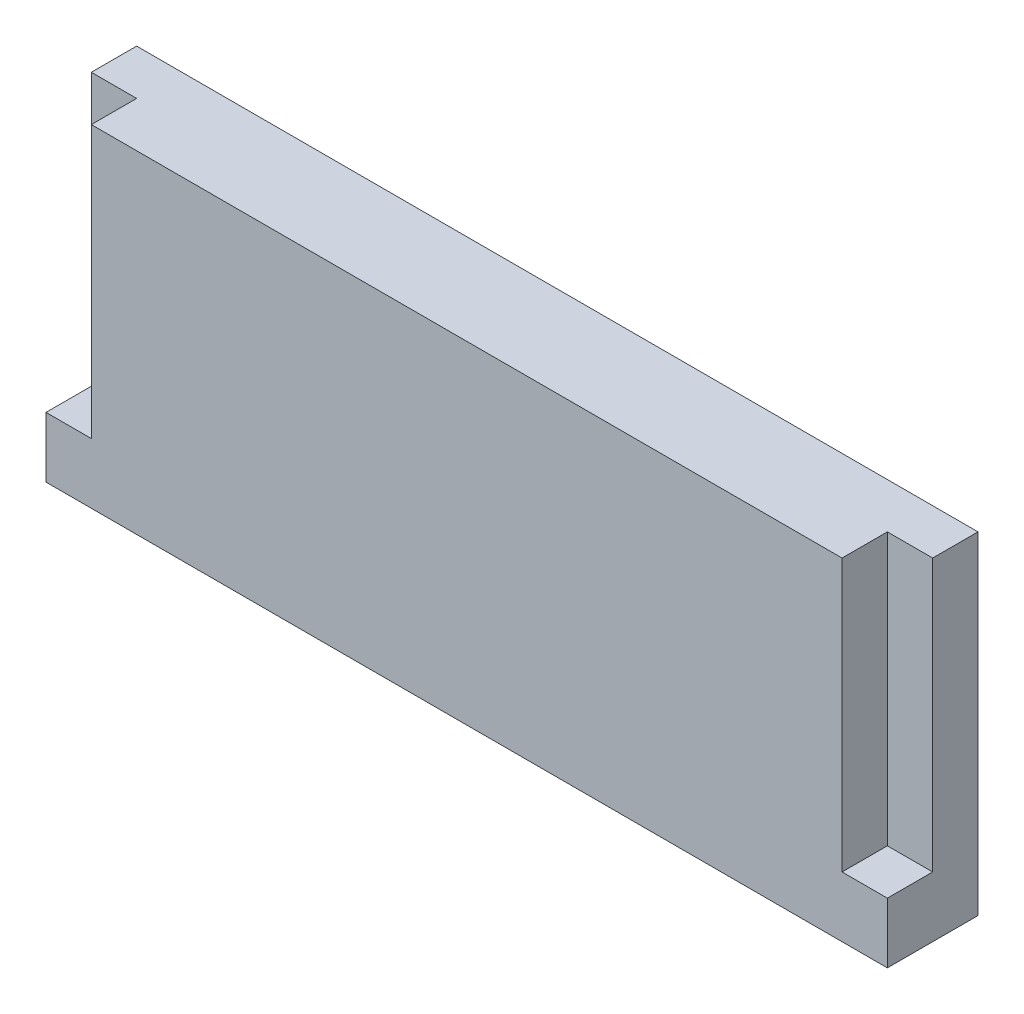
ISO-10303-21;
HEADER;
FILE_DESCRIPTION(('STEP AP214'),'2;1');
FILE_NAME('part.step','',(''),(''),'','','');
FILE_SCHEMA(('AUTOMOTIVE_DESIGN { 1 0 10303 214 1 1 1 1 }'));
ENDSEC;
DATA;
#1=APPLICATION_CONTEXT('core data for automotive mechanical design processes');
#2=APPLICATION_PROTOCOL_DEFINITION('international standard','automotive_design',2000,#1);
#3=PRODUCT_CONTEXT('',#1,'mechanical');
#4=PRODUCT('Part','Part','',(#3));
#5=PRODUCT_RELATED_PRODUCT_CATEGORY('part','',(#4));
#6=PRODUCT_DEFINITION_FORMATION('','',#4);
#7=PRODUCT_DEFINITION_CONTEXT('part definition',#1,'design');
#8=PRODUCT_DEFINITION('design','',#6,#7);
#9=PRODUCT_DEFINITION_SHAPE('','',#8);
#10=(LENGTH_UNIT() NAMED_UNIT(*) SI_UNIT(.MILLI.,.METRE.));
#11=(NAMED_UNIT(*) PLANE_ANGLE_UNIT() SI_UNIT($,.RADIAN.));
#12=(NAMED_UNIT(*) SI_UNIT($,.STERADIAN.) SOLID_ANGLE_UNIT());
#13=UNCERTAINTY_MEASURE_WITH_UNIT(LENGTH_MEASURE(1.E-05),#10,'distance_accuracy_value','');
#14=(GEOMETRIC_REPRESENTATION_CONTEXT(3) GLOBAL_UNCERTAINTY_ASSIGNED_CONTEXT((#13)) GLOBAL_UNIT_ASSIGNED_CONTEXT((#10,
#11,#12)) REPRESENTATION_CONTEXT('',''));
#15=CARTESIAN_POINT('',(0.,0.,0.));
#16=DIRECTION('',(0.,0.,1.));
#17=DIRECTION('',(1.,0.,0.));
#18=AXIS2_PLACEMENT_3D('',#15,#16,#17);
#19=CARTESIAN_POINT('',(0.,18.,-3.));
#20=DIRECTION('',(1.,0.,0.));
#21=DIRECTION('',(0.,0.,-1.));
#22=AXIS2_PLACEMENT_3D('',#19,#20,#21);
#23=PLANE('',#22);
#24=DIRECTION('',(0.,-1.,0.));
#25=VECTOR('',#24,1.);
#26=CARTESIAN_POINT('',(0.,18.,-3.));
#27=LINE('',#26,#25);
#28=CARTESIAN_POINT('',(0.,18.,-3.));
#29=VERTEX_POINT('',#28);
#30=CARTESIAN_POINT('',(0.,-4.,-3.00000000000001));
#31=VERTEX_POINT('',#30);
#32=EDGE_CURVE('E109',#29,#31,#27,.T.);
#33=ORIENTED_EDGE('',*,*,#32,.T.);
#34=DIRECTION('',(0.,0.,-1.));
#35=VECTOR('',#34,1.);
#36=CARTESIAN_POINT('',(0.,-4.,3.));
#37=LINE('',#36,#35);
#38=CARTESIAN_POINT('',(0.,-4.,3.));
#39=VERTEX_POINT('',#38);
#40=EDGE_CURVE('E113',#39,#31,#37,.T.);
#41=ORIENTED_EDGE('',*,*,#40,.F.);
#42=DIRECTION('',(0.,1.,0.));
#43=VECTOR('',#42,1.);
#44=CARTESIAN_POINT('',(0.,-4.,3.));
#45=LINE('',#44,#43);
#46=CARTESIAN_POINT('',(0.,0.,3.));
#47=VERTEX_POINT('',#46);
#48=EDGE_CURVE('E139',#39,#47,#45,.T.);
#49=ORIENTED_EDGE('',*,*,#48,.T.);
#50=DIRECTION('',(0.,0.,-1.));
#51=VECTOR('',#50,1.);
#52=CARTESIAN_POINT('',(0.,0.,3.));
#53=LINE('',#52,#51);
#54=CARTESIAN_POINT('',(0.,0.,0.));
#55=VERTEX_POINT('',#54);
#56=EDGE_CURVE('E145',#47,#55,#53,.T.);
#57=ORIENTED_EDGE('',*,*,#56,.T.);
#58=DIRECTION('',(0.,-1.,0.));
#59=VECTOR('',#58,1.);
#60=CARTESIAN_POINT('',(0.,18.,0.));
#61=LINE('',#60,#59);
#62=CARTESIAN_POINT('',(0.,18.,0.));
#63=VERTEX_POINT('',#62);
#64=EDGE_CURVE('E11',#63,#55,#61,.T.);
#65=ORIENTED_EDGE('',*,*,#64,.F.);
#66=DIRECTION('',(0.,0.,1.));
#67=VECTOR('',#66,1.);
#68=CARTESIAN_POINT('',(0.,18.,-3.));
#69=LINE('',#68,#67);
#70=EDGE_CURVE('E115',#29,#63,#69,.T.);
#71=ORIENTED_EDGE('',*,*,#70,.F.);
#72=EDGE_LOOP('',(#33,#41,#49,#57,#65,#71));
#73=FACE_BOUND('',#72,.T.);
#74=ADVANCED_FACE('F35',(#73),#23,.F.);
#75=CARTESIAN_POINT('',(0.,18.,0.));
#76=DIRECTION('',(0.,0.,-1.));
#77=DIRECTION('',(-1.,0.,0.));
#78=AXIS2_PLACEMENT_3D('',#75,#76,#77);
#79=PLANE('',#78);
#80=DIRECTION('',(1.,0.,0.));
#81=VECTOR('',#80,1.);
#82=CARTESIAN_POINT('',(0.,0.,0.));
#83=LINE('',#82,#81);
#84=CARTESIAN_POINT('',(3.,0.,0.));
#85=VERTEX_POINT('',#84);
#86=EDGE_CURVE('E157',#55,#85,#83,.T.);
#87=ORIENTED_EDGE('',*,*,#86,.T.);
#88=DIRECTION('',(0.,-1.,0.));
#89=VECTOR('',#88,1.);
#90=CARTESIAN_POINT('',(3.,18.,0.));
#91=LINE('',#90,#89);
#92=CARTESIAN_POINT('',(3.,18.,0.));
#93=VERTEX_POINT('',#92);
#94=EDGE_CURVE('E44',#93,#85,#91,.T.);
#95=ORIENTED_EDGE('',*,*,#94,.F.);
#96=DIRECTION('',(1.,0.,0.));
#97=VECTOR('',#96,1.);
#98=CARTESIAN_POINT('',(0.,18.,0.));
#99=LINE('',#98,#97);
#100=EDGE_CURVE('E227',#63,#93,#99,.T.);
#101=ORIENTED_EDGE('',*,*,#100,.F.);
#102=ORIENTED_EDGE('',*,*,#64,.T.);
#103=EDGE_LOOP('',(#87,#95,#101,#102));
#104=FACE_BOUND('',#103,.T.);
#105=ADVANCED_FACE('F226',(#104),#79,.F.);
#106=CARTESIAN_POINT('',(3.,18.,0.));
#107=DIRECTION('',(1.,0.,0.));
#108=DIRECTION('',(0.,0.,-1.));
#109=AXIS2_PLACEMENT_3D('',#106,#107,#108);
#110=PLANE('',#109);
#111=DIRECTION('',(0.,0.,1.));
#112=VECTOR('',#111,1.);
#113=CARTESIAN_POINT('',(3.,0.,0.));
#114=LINE('',#113,#112);
#115=CARTESIAN_POINT('',(3.,0.,3.));
#116=VERTEX_POINT('',#115);
#117=EDGE_CURVE('E162',#85,#116,#114,.T.);
#118=ORIENTED_EDGE('',*,*,#117,.T.);
#119=DIRECTION('',(0.,-1.,0.));
#120=VECTOR('',#119,1.);
#121=CARTESIAN_POINT('',(3.,18.,3.));
#122=LINE('',#121,#120);
#123=CARTESIAN_POINT('',(3.,18.,3.));
#124=VERTEX_POINT('',#123);
#125=EDGE_CURVE('E195',#124,#116,#122,.T.);
#126=ORIENTED_EDGE('',*,*,#125,.F.);
#127=DIRECTION('',(0.,0.,1.));
#128=VECTOR('',#127,1.);
#129=CARTESIAN_POINT('',(3.,18.,0.));
#130=LINE('',#129,#128);
#131=EDGE_CURVE('E225',#93,#124,#130,.T.);
#132=ORIENTED_EDGE('',*,*,#131,.F.);
#133=ORIENTED_EDGE('',*,*,#94,.T.);
#134=EDGE_LOOP('',(#118,#126,#132,#133));
#135=FACE_BOUND('',#134,.T.);
#136=ADVANCED_FACE('F223',(#135),#110,.F.);
#137=CARTESIAN_POINT('',(3.,18.,3.));
#138=DIRECTION('',(0.,0.,-1.));
#139=DIRECTION('',(-1.,0.,0.));
#140=AXIS2_PLACEMENT_3D('',#137,#138,#139);
#141=PLANE('',#140);
#142=ORIENTED_EDGE('',*,*,#125,.T.);
#143=DIRECTION('',(-1.,0.,0.));
#144=VECTOR('',#143,1.);
#145=CARTESIAN_POINT('',(0.,0.,3.));
#146=LINE('',#145,#144);
#147=EDGE_CURVE('E134',#116,#47,#146,.T.);
#148=ORIENTED_EDGE('',*,*,#147,.T.);
#149=ORIENTED_EDGE('',*,*,#48,.F.);
#150=DIRECTION('',(-1.,0.,0.));
#151=VECTOR('',#150,1.);
#152=CARTESIAN_POINT('',(0.,-4.,3.));
#153=LINE('',#152,#151);
#154=CARTESIAN_POINT('',(55.7,-4.,3.));
#155=VERTEX_POINT('',#154);
#156=EDGE_CURVE('E129',#155,#39,#153,.T.);
#157=ORIENTED_EDGE('',*,*,#156,.F.);
#158=DIRECTION('',(0.,1.,0.));
#159=VECTOR('',#158,1.);
#160=CARTESIAN_POINT('',(55.7,-4.,3.));
#161=LINE('',#160,#159);
#162=CARTESIAN_POINT('',(55.7,0.,3.));
#163=VERTEX_POINT('',#162);
#164=EDGE_CURVE('E149',#155,#163,#161,.T.);
#165=ORIENTED_EDGE('',*,*,#164,.T.);
#166=CARTESIAN_POINT('',(52.7,0.,3.));
#167=VERTEX_POINT('',#166);
#168=EDGE_CURVE('E131',#163,#167,#146,.T.);
#169=ORIENTED_EDGE('',*,*,#168,.T.);
#170=DIRECTION('',(0.,-1.,0.));
#171=VECTOR('',#170,1.);
#172=CARTESIAN_POINT('',(52.7,18.,3.));
#173=LINE('',#172,#171);
#174=CARTESIAN_POINT('',(52.7,18.,3.));
#175=VERTEX_POINT('',#174);
#176=EDGE_CURVE('E190',#175,#167,#173,.T.);
#177=ORIENTED_EDGE('',*,*,#176,.F.);
#178=DIRECTION('',(1.,0.,0.));
#179=VECTOR('',#178,1.);
#180=CARTESIAN_POINT('',(3.,18.,3.));
#181=LINE('',#180,#179);
#182=EDGE_CURVE('E235',#124,#175,#181,.T.);
#183=ORIENTED_EDGE('',*,*,#182,.F.);
#184=EDGE_LOOP('',(#142,#148,#149,#157,#165,#169,#177,#183));
#185=FACE_BOUND('',#184,.T.);
#186=ADVANCED_FACE('F240',(#185),#141,.F.);
#187=CARTESIAN_POINT('',(52.7,18.,3.));
#188=DIRECTION('',(-1.,0.,0.));
#189=DIRECTION('',(0.,0.,1.));
#190=AXIS2_PLACEMENT_3D('',#187,#188,#189);
#191=PLANE('',#190);
#192=DIRECTION('',(0.,0.,-1.));
#193=VECTOR('',#192,1.);
#194=CARTESIAN_POINT('',(52.7,0.,3.));
#195=LINE('',#194,#193);
#196=CARTESIAN_POINT('',(52.7,0.,0.));
#197=VERTEX_POINT('',#196);
#198=EDGE_CURVE('E168',#167,#197,#195,.T.);
#199=ORIENTED_EDGE('',*,*,#198,.T.);
#200=DIRECTION('',(0.,-1.,0.));
#201=VECTOR('',#200,1.);
#202=CARTESIAN_POINT('',(52.7,18.,0.));
#203=LINE('',#202,#201);
#204=CARTESIAN_POINT('',(52.7,18.,0.));
#205=VERTEX_POINT('',#204);
#206=EDGE_CURVE('E188',#205,#197,#203,.T.);
#207=ORIENTED_EDGE('',*,*,#206,.F.);
#208=DIRECTION('',(0.,0.,-1.));
#209=VECTOR('',#208,1.);
#210=CARTESIAN_POINT('',(52.7,18.,3.));
#211=LINE('',#210,#209);
#212=EDGE_CURVE('E237',#175,#205,#211,.T.);
#213=ORIENTED_EDGE('',*,*,#212,.F.);
#214=ORIENTED_EDGE('',*,*,#176,.T.);
#215=EDGE_LOOP('',(#199,#207,#213,#214));
#216=FACE_BOUND('',#215,.T.);
#217=ADVANCED_FACE('F209',(#216),#191,.F.);
#218=CARTESIAN_POINT('',(52.7,18.,0.));
#219=DIRECTION('',(0.,0.,-1.));
#220=DIRECTION('',(-1.,0.,0.));
#221=AXIS2_PLACEMENT_3D('',#218,#219,#220);
#222=PLANE('',#221);
#223=DIRECTION('',(1.,0.,0.));
#224=VECTOR('',#223,1.);
#225=CARTESIAN_POINT('',(52.7,0.,0.));
#226=LINE('',#225,#224);
#227=CARTESIAN_POINT('',(55.7,0.,0.));
#228=VERTEX_POINT('',#227);
#229=EDGE_CURVE('E177',#197,#228,#226,.T.);
#230=ORIENTED_EDGE('',*,*,#229,.T.);
#231=DIRECTION('',(0.,-1.,0.));
#232=VECTOR('',#231,1.);
#233=CARTESIAN_POINT('',(55.7,18.,0.));
#234=LINE('',#233,#232);
#235=CARTESIAN_POINT('',(55.7,18.,0.));
#236=VERTEX_POINT('',#235);
#237=EDGE_CURVE('E181',#236,#228,#234,.T.);
#238=ORIENTED_EDGE('',*,*,#237,.F.);
#239=DIRECTION('',(1.,0.,0.));
#240=VECTOR('',#239,1.);
#241=CARTESIAN_POINT('',(52.7,18.,0.));
#242=LINE('',#241,#240);
#243=EDGE_CURVE('E204',#205,#236,#242,.T.);
#244=ORIENTED_EDGE('',*,*,#243,.F.);
#245=ORIENTED_EDGE('',*,*,#206,.T.);
#246=EDGE_LOOP('',(#230,#238,#244,#245));
#247=FACE_BOUND('',#246,.T.);
#248=ADVANCED_FACE('F203',(#247),#222,.F.);
#249=CARTESIAN_POINT('',(55.7,18.,0.));
#250=DIRECTION('',(-1.,0.,0.));
#251=DIRECTION('',(0.,0.,1.));
#252=AXIS2_PLACEMENT_3D('',#249,#250,#251);
#253=PLANE('',#252);
#254=ORIENTED_EDGE('',*,*,#237,.T.);
#255=DIRECTION('',(0.,0.,1.));
#256=VECTOR('',#255,1.);
#257=CARTESIAN_POINT('',(55.7,0.,3.));
#258=LINE('',#257,#256);
#259=EDGE_CURVE('E148',#228,#163,#258,.T.);
#260=ORIENTED_EDGE('',*,*,#259,.T.);
#261=ORIENTED_EDGE('',*,*,#164,.F.);
#262=DIRECTION('',(0.,0.,1.));
#263=VECTOR('',#262,1.);
#264=CARTESIAN_POINT('',(55.7,-4.,3.));
#265=LINE('',#264,#263);
#266=CARTESIAN_POINT('',(55.7,-4.,-3.00000000000001));
#267=VERTEX_POINT('',#266);
#268=EDGE_CURVE('E125',#267,#155,#265,.T.);
#269=ORIENTED_EDGE('',*,*,#268,.F.);
#270=DIRECTION('',(0.,-1.,0.));
#271=VECTOR('',#270,1.);
#272=CARTESIAN_POINT('',(55.7,18.,-3.00000000000001));
#273=LINE('',#272,#271);
#274=CARTESIAN_POINT('',(55.7,18.,-3.00000000000001));
#275=VERTEX_POINT('',#274);
#276=EDGE_CURVE('E117',#275,#267,#273,.T.);
#277=ORIENTED_EDGE('',*,*,#276,.F.);
#278=DIRECTION('',(0.,0.,-1.));
#279=VECTOR('',#278,1.);
#280=CARTESIAN_POINT('',(55.7,18.,0.));
#281=LINE('',#280,#279);
#282=EDGE_CURVE('E202',#236,#275,#281,.T.);
#283=ORIENTED_EDGE('',*,*,#282,.F.);
#284=EDGE_LOOP('',(#254,#260,#261,#269,#277,#283));
#285=FACE_BOUND('',#284,.T.);
#286=ADVANCED_FACE('F201',(#285),#253,.F.);
#287=CARTESIAN_POINT('',(55.7,18.,-3.00000000000001));
#288=DIRECTION('',(0.,0.,1.));
#289=DIRECTION('',(1.,0.,0.));
#290=AXIS2_PLACEMENT_3D('',#287,#288,#289);
#291=PLANE('',#290);
#292=ORIENTED_EDGE('',*,*,#276,.T.);
#293=DIRECTION('',(1.,0.,0.));
#294=VECTOR('',#293,1.);
#295=CARTESIAN_POINT('',(0.,-4.,-3.00000000000001));
#296=LINE('',#295,#294);
#297=EDGE_CURVE('E120',#31,#267,#296,.T.);
#298=ORIENTED_EDGE('',*,*,#297,.F.);
#299=ORIENTED_EDGE('',*,*,#32,.F.);
#300=DIRECTION('',(-1.,0.,0.));
#301=VECTOR('',#300,1.);
#302=CARTESIAN_POINT('',(55.7,18.,-3.00000000000001));
#303=LINE('',#302,#301);
#304=EDGE_CURVE('E52',#275,#29,#303,.T.);
#305=ORIENTED_EDGE('',*,*,#304,.F.);
#306=EDGE_LOOP('',(#292,#298,#299,#305));
#307=FACE_BOUND('',#306,.T.);
#308=ADVANCED_FACE('F121',(#307),#291,.F.);
#309=CARTESIAN_POINT('',(0.,18.,0.));
#310=DIRECTION('',(0.,1.,0.));
#311=DIRECTION('',(0.,0.,1.));
#312=AXIS2_PLACEMENT_3D('',#309,#310,#311);
#313=PLANE('',#312);
#314=ORIENTED_EDGE('',*,*,#70,.T.);
#315=ORIENTED_EDGE('',*,*,#100,.T.);
#316=ORIENTED_EDGE('',*,*,#131,.T.);
#317=ORIENTED_EDGE('',*,*,#182,.T.);
#318=ORIENTED_EDGE('',*,*,#212,.T.);
#319=ORIENTED_EDGE('',*,*,#243,.T.);
#320=ORIENTED_EDGE('',*,*,#282,.T.);
#321=ORIENTED_EDGE('',*,*,#304,.T.);
#322=EDGE_LOOP('',(#314,#315,#316,#317,#318,#319,#320,#321));
#323=FACE_BOUND('',#322,.T.);
#324=ADVANCED_FACE('F229',(#323),#313,.T.);
#325=CARTESIAN_POINT('',(0.,0.,0.));
#326=DIRECTION('',(0.,-1.,0.));
#327=DIRECTION('',(0.,0.,-1.));
#328=AXIS2_PLACEMENT_3D('',#325,#326,#327);
#329=PLANE('',#328);
#330=ORIENTED_EDGE('',*,*,#229,.F.);
#331=ORIENTED_EDGE('',*,*,#198,.F.);
#332=ORIENTED_EDGE('',*,*,#168,.F.);
#333=ORIENTED_EDGE('',*,*,#259,.F.);
#334=EDGE_LOOP('',(#330,#331,#332,#333));
#335=FACE_BOUND('',#334,.T.);
#336=ADVANCED_FACE('F207',(#335),#329,.F.);
#337=CARTESIAN_POINT('',(0.,-4.,0.));
#338=DIRECTION('',(0.,-1.,0.));
#339=DIRECTION('',(0.,0.,-1.));
#340=AXIS2_PLACEMENT_3D('',#337,#338,#339);
#341=PLANE('',#340);
#342=ORIENTED_EDGE('',*,*,#40,.T.);
#343=ORIENTED_EDGE('',*,*,#297,.T.);
#344=ORIENTED_EDGE('',*,*,#268,.T.);
#345=ORIENTED_EDGE('',*,*,#156,.T.);
#346=EDGE_LOOP('',(#342,#343,#344,#345));
#347=FACE_BOUND('',#346,.T.);
#348=ADVANCED_FACE('F127',(#347),#341,.T.);
#349=ORIENTED_EDGE('',*,*,#117,.F.);
#350=ORIENTED_EDGE('',*,*,#86,.F.);
#351=ORIENTED_EDGE('',*,*,#56,.F.);
#352=ORIENTED_EDGE('',*,*,#147,.F.);
#353=EDGE_LOOP('',(#349,#350,#351,#352));
#354=FACE_BOUND('',#353,.T.);
#355=ADVANCED_FACE('F232',(#354),#329,.F.);
#356=CLOSED_SHELL('',(#74,#105,#136,#186,#217,#248,#286,#308,#324,#336,#348,#355));
#357=MANIFOLD_SOLID_BREP('B2',#356);
#358=ADVANCED_BREP_SHAPE_REPRESENTATION('',(#18,#357),#14);
#359=SHAPE_DEFINITION_REPRESENTATION(#9,#358);
ENDSEC;
END-ISO-10303-21;
